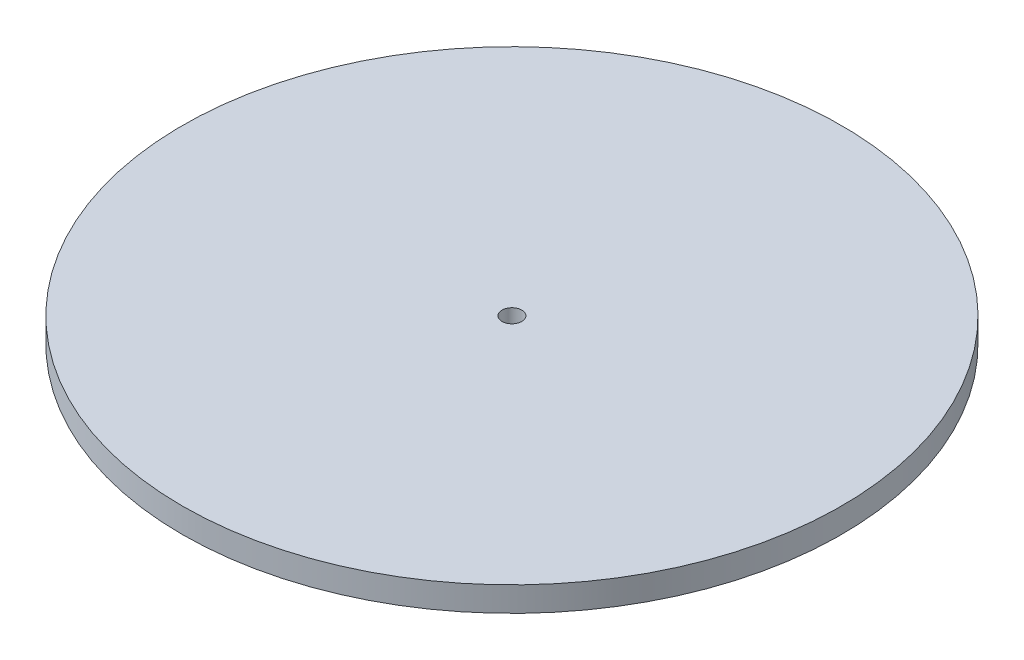
ISO-10303-21;
HEADER;
FILE_DESCRIPTION(('STEP AP214'),'2;1');
FILE_NAME('part.step','',(''),(''),'','','');
FILE_SCHEMA(('AUTOMOTIVE_DESIGN { 1 0 10303 214 1 1 1 1 }'));
ENDSEC;
DATA;
#1=APPLICATION_CONTEXT('core data for automotive mechanical design processes');
#2=APPLICATION_PROTOCOL_DEFINITION('international standard','automotive_design',2000,#1);
#3=PRODUCT_CONTEXT('',#1,'mechanical');
#4=PRODUCT('Part','Part','',(#3));
#5=PRODUCT_RELATED_PRODUCT_CATEGORY('part','',(#4));
#6=PRODUCT_DEFINITION_FORMATION('','',#4);
#7=PRODUCT_DEFINITION_CONTEXT('part definition',#1,'design');
#8=PRODUCT_DEFINITION('design','',#6,#7);
#9=PRODUCT_DEFINITION_SHAPE('','',#8);
#10=(LENGTH_UNIT() NAMED_UNIT(*) SI_UNIT(.MILLI.,.METRE.));
#11=(NAMED_UNIT(*) PLANE_ANGLE_UNIT() SI_UNIT($,.RADIAN.));
#12=(NAMED_UNIT(*) SI_UNIT($,.STERADIAN.) SOLID_ANGLE_UNIT());
#13=UNCERTAINTY_MEASURE_WITH_UNIT(LENGTH_MEASURE(1.E-05),#10,'distance_accuracy_value','');
#14=(GEOMETRIC_REPRESENTATION_CONTEXT(3) GLOBAL_UNCERTAINTY_ASSIGNED_CONTEXT((#13)) GLOBAL_UNIT_ASSIGNED_CONTEXT((#10,
#11,#12)) REPRESENTATION_CONTEXT('',''));
#15=CARTESIAN_POINT('',(0.,0.,0.));
#16=DIRECTION('',(0.,0.,1.));
#17=DIRECTION('',(1.,0.,0.));
#18=AXIS2_PLACEMENT_3D('',#15,#16,#17);
#19=CARTESIAN_POINT('',(0.,15.9735054529919,0.));
#20=DIRECTION('',(0.,1.,0.));
#21=DIRECTION('',(0.,0.,1.));
#22=AXIS2_PLACEMENT_3D('',#19,#20,#21);
#23=CYLINDRICAL_SURFACE('',#22,40.);
#24=CARTESIAN_POINT('',(0.,15.9735054529919,0.));
#25=DIRECTION('',(0.,1.,0.));
#26=DIRECTION('',(0.,0.,1.));
#27=AXIS2_PLACEMENT_3D('',#24,#25,#26);
#28=CIRCLE('',#27,40.);
#29=CARTESIAN_POINT('',(0.,15.9735054529919,40.));
#30=VERTEX_POINT('',#29);
#31=EDGE_CURVE('E50',#30,#30,#28,.T.);
#32=ORIENTED_EDGE('',*,*,#31,.F.);
#33=EDGE_LOOP('',(#32));
#34=FACE_BOUND('',#33,.T.);
#35=CARTESIAN_POINT('',(0.,12.9735054529919,0.));
#36=DIRECTION('',(0.,1.,0.));
#37=DIRECTION('',(0.,0.,1.));
#38=AXIS2_PLACEMENT_3D('',#35,#36,#37);
#39=CIRCLE('',#38,40.);
#40=CARTESIAN_POINT('',(0.,12.9735054529919,40.));
#41=VERTEX_POINT('',#40);
#42=EDGE_CURVE('E10',#41,#41,#39,.T.);
#43=ORIENTED_EDGE('',*,*,#42,.T.);
#44=EDGE_LOOP('',(#43));
#45=FACE_BOUND('',#44,.T.);
#46=ADVANCED_FACE('F31',(#34,#45),#23,.T.);
#47=CARTESIAN_POINT('',(37.,12.9735054529919,0.));
#48=DIRECTION('',(0.,1.,0.));
#49=DIRECTION('',(0.,0.,1.));
#50=AXIS2_PLACEMENT_3D('',#47,#48,#49);
#51=PLANE('',#50);
#52=ORIENTED_EDGE('',*,*,#42,.F.);
#53=EDGE_LOOP('',(#52));
#54=FACE_BOUND('',#53,.T.);
#55=CARTESIAN_POINT('',(0.,12.9735054529919,0.));
#56=DIRECTION('',(0.,1.,0.));
#57=DIRECTION('',(0.,0.,1.));
#58=AXIS2_PLACEMENT_3D('',#55,#56,#57);
#59=CIRCLE('',#58,37.);
#60=CARTESIAN_POINT('',(0.,12.9735054529919,37.));
#61=VERTEX_POINT('',#60);
#62=EDGE_CURVE('E37',#61,#61,#59,.T.);
#63=ORIENTED_EDGE('',*,*,#62,.T.);
#64=EDGE_LOOP('',(#63));
#65=FACE_BOUND('',#64,.T.);
#66=ADVANCED_FACE('F71',(#54,#65),#51,.F.);
#67=CARTESIAN_POINT('',(0.,15.9735054529919,0.));
#68=DIRECTION('',(0.,1.,0.));
#69=DIRECTION('',(0.,0.,1.));
#70=AXIS2_PLACEMENT_3D('',#67,#68,#69);
#71=CYLINDRICAL_SURFACE('',#70,36.9999999999918);
#72=ORIENTED_EDGE('',*,*,#62,.F.);
#73=EDGE_LOOP('',(#72));
#74=FACE_BOUND('',#73,.T.);
#75=CARTESIAN_POINT('',(0.,11.9735054529853,0.));
#76=DIRECTION('',(0.,1.,0.));
#77=DIRECTION('',(0.,0.,1.));
#78=AXIS2_PLACEMENT_3D('',#75,#76,#77);
#79=CIRCLE('',#78,36.9999999999836);
#80=CARTESIAN_POINT('',(0.,11.9735054529853,36.9999999999836));
#81=VERTEX_POINT('',#80);
#82=EDGE_CURVE('E41',#81,#81,#79,.T.);
#83=ORIENTED_EDGE('',*,*,#82,.T.);
#84=EDGE_LOOP('',(#83));
#85=FACE_BOUND('',#84,.T.);
#86=ADVANCED_FACE('F67',(#74,#85),#71,.T.);
#87=CARTESIAN_POINT('',(0.,0.,0.));
#88=CARTESIAN_POINT('',(4.62499999164288,-0.000821627459919279,0.));
#89=CARTESIAN_POINT('',(9.24999998829012,0.895307710853164,0.));
#90=CARTESIAN_POINT('',(13.8749999901997,2.734627000893,0.));
#91=CARTESIAN_POINT('',(18.4999999910242,4.37945846412234,0.));
#92=CARTESIAN_POINT('',(23.124999993698,6.35575180348765,0.));
#93=CARTESIAN_POINT('',(27.7499999956908,8.2099797429868,0.));
#94=CARTESIAN_POINT('',(32.3749999979501,10.1119861715217,0.));
#95=CARTESIAN_POINT('',(36.9999999999836,11.9735054529853,0.));
#96=B_SPLINE_CURVE_WITH_KNOTS('',8,(#87,#88,#89,#90,#91,#92,#93,#94,#95),.UNSPECIFIED.,.F.,.F.,
(9,9),(0.0834666693636544,0.918133361492817),.UNSPECIFIED.);
#97=CARTESIAN_POINT('',(0.,15.9735054529919,0.));
#98=DIRECTION('',(0.,1.,0.));
#99=AXIS1_PLACEMENT('',#97,#98);
#100=SURFACE_OF_REVOLUTION('',#96,#99);
#101=CARTESIAN_POINT('',(0.,0.0262061481118431,0.));
#102=DIRECTION('',(0.,1.,0.));
#103=DIRECTION('',(0.,0.,1.));
#104=AXIS2_PLACEMENT_3D('',#101,#102,#103);
#105=CIRCLE('',#104,1.2);
#106=CARTESIAN_POINT('',(0.,0.0262061481118431,1.2));
#107=VERTEX_POINT('',#106);
#108=EDGE_CURVE('E53',#107,#107,#105,.T.);
#109=ORIENTED_EDGE('',*,*,#108,.T.);
#110=EDGE_LOOP('',(#109));
#111=FACE_BOUND('',#110,.T.);
#112=ORIENTED_EDGE('',*,*,#82,.F.);
#113=EDGE_LOOP('',(#112));
#114=FACE_BOUND('',#113,.T.);
#115=ADVANCED_FACE('F62',(#111,#114),#100,.T.);
#116=CARTESIAN_POINT('',(0.,15.9735054529919,0.));
#117=DIRECTION('',(0.,1.,0.));
#118=DIRECTION('',(0.,0.,1.));
#119=AXIS2_PLACEMENT_3D('',#116,#117,#118);
#120=CYLINDRICAL_SURFACE('',#119,1.2);
#121=CARTESIAN_POINT('',(0.,15.9735054529919,0.));
#122=DIRECTION('',(0.,1.,0.));
#123=DIRECTION('',(0.,0.,1.));
#124=AXIS2_PLACEMENT_3D('',#121,#122,#123);
#125=CIRCLE('',#124,1.2);
#126=CARTESIAN_POINT('',(0.,15.9735054529919,1.2));
#127=VERTEX_POINT('',#126);
#128=EDGE_CURVE('E45',#127,#127,#125,.T.);
#129=ORIENTED_EDGE('',*,*,#128,.T.);
#130=EDGE_LOOP('',(#129));
#131=FACE_BOUND('',#130,.T.);
#132=ORIENTED_EDGE('',*,*,#108,.F.);
#133=EDGE_LOOP('',(#132));
#134=FACE_BOUND('',#133,.T.);
#135=ADVANCED_FACE('F66',(#131,#134),#120,.F.);
#136=CARTESIAN_POINT('',(40.,15.9735054529919,0.));
#137=DIRECTION('',(0.,-1.,0.));
#138=DIRECTION('',(0.,0.,-1.));
#139=AXIS2_PLACEMENT_3D('',#136,#137,#138);
#140=PLANE('',#139);
#141=ORIENTED_EDGE('',*,*,#128,.F.);
#142=EDGE_LOOP('',(#141));
#143=FACE_BOUND('',#142,.T.);
#144=ORIENTED_EDGE('',*,*,#31,.T.);
#145=EDGE_LOOP('',(#144));
#146=FACE_BOUND('',#145,.T.);
#147=ADVANCED_FACE('F83',(#143,#146),#140,.F.);
#148=CLOSED_SHELL('',(#46,#66,#86,#115,#135,#147));
#149=MANIFOLD_SOLID_BREP('B2',#148);
#150=ADVANCED_BREP_SHAPE_REPRESENTATION('',(#18,#149),#14);
#151=SHAPE_DEFINITION_REPRESENTATION(#9,#150);
ENDSEC;
END-ISO-10303-21;
